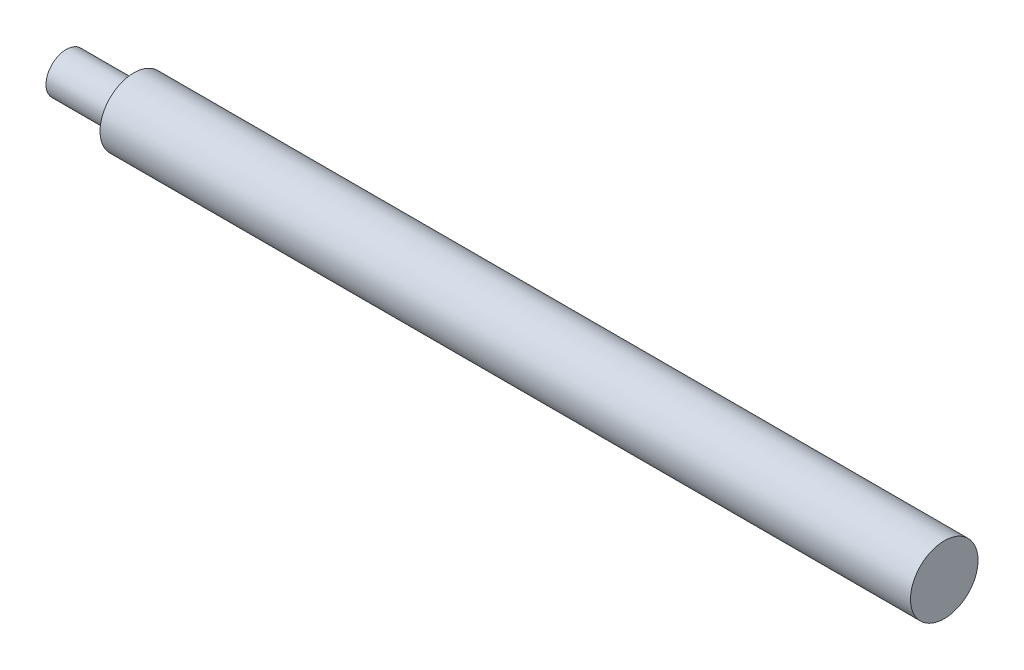
ISO-10303-21;
HEADER;
FILE_DESCRIPTION(('STEP AP214'),'2;1');
FILE_NAME('part.step','',(''),(''),'','','');
FILE_SCHEMA(('AUTOMOTIVE_DESIGN { 1 0 10303 214 1 1 1 1 }'));
ENDSEC;
DATA;
#1=APPLICATION_CONTEXT('core data for automotive mechanical design processes');
#2=APPLICATION_PROTOCOL_DEFINITION('international standard','automotive_design',2000,#1);
#3=PRODUCT_CONTEXT('',#1,'mechanical');
#4=PRODUCT('Part','Part','',(#3));
#5=PRODUCT_RELATED_PRODUCT_CATEGORY('part','',(#4));
#6=PRODUCT_DEFINITION_FORMATION('','',#4);
#7=PRODUCT_DEFINITION_CONTEXT('part definition',#1,'design');
#8=PRODUCT_DEFINITION('design','',#6,#7);
#9=PRODUCT_DEFINITION_SHAPE('','',#8);
#10=(LENGTH_UNIT() NAMED_UNIT(*) SI_UNIT(.MILLI.,.METRE.));
#11=(NAMED_UNIT(*) PLANE_ANGLE_UNIT() SI_UNIT($,.RADIAN.));
#12=(NAMED_UNIT(*) SI_UNIT($,.STERADIAN.) SOLID_ANGLE_UNIT());
#13=UNCERTAINTY_MEASURE_WITH_UNIT(LENGTH_MEASURE(1.E-05),#10,'distance_accuracy_value','');
#14=(GEOMETRIC_REPRESENTATION_CONTEXT(3) GLOBAL_UNCERTAINTY_ASSIGNED_CONTEXT((#13)) GLOBAL_UNIT_ASSIGNED_CONTEXT((#10,
#11,#12)) REPRESENTATION_CONTEXT('',''));
#15=CARTESIAN_POINT('',(0.,0.,0.));
#16=DIRECTION('',(0.,0.,1.));
#17=DIRECTION('',(1.,0.,0.));
#18=AXIS2_PLACEMENT_3D('',#15,#16,#17);
#19=CARTESIAN_POINT('',(-55.2920778714341,3.,0.));
#20=DIRECTION('',(1.,0.,0.));
#21=DIRECTION('',(0.,0.,-1.));
#22=AXIS2_PLACEMENT_3D('',#19,#20,#21);
#23=PLANE('',#22);
#24=CARTESIAN_POINT('',(-55.2920778714341,0.,0.));
#25=DIRECTION('',(-1.,0.,0.));
#26=DIRECTION('',(0.,0.,1.));
#27=AXIS2_PLACEMENT_3D('',#24,#25,#26);
#28=CIRCLE('',#27,3.);
#29=CARTESIAN_POINT('',(-55.2920778714341,0.,3.));
#30=VERTEX_POINT('',#29);
#31=EDGE_CURVE('E45',#30,#30,#28,.T.);
#32=ORIENTED_EDGE('',*,*,#31,.T.);
#33=EDGE_LOOP('',(#32));
#34=FACE_BOUND('',#33,.T.);
#35=ADVANCED_FACE('F31',(#34),#23,.F.);
#36=CARTESIAN_POINT('',(74.7079221285659,0.,0.));
#37=DIRECTION('',(-1.,0.,0.));
#38=DIRECTION('',(0.,0.,1.));
#39=AXIS2_PLACEMENT_3D('',#36,#37,#38);
#40=PLANE('',#39);
#41=CARTESIAN_POINT('',(74.7079221285659,0.,0.));
#42=DIRECTION('',(-1.,0.,0.));
#43=DIRECTION('',(0.,0.,1.));
#44=AXIS2_PLACEMENT_3D('',#41,#42,#43);
#45=CIRCLE('',#44,5.);
#46=CARTESIAN_POINT('',(74.7079221285659,0.,5.));
#47=VERTEX_POINT('',#46);
#48=EDGE_CURVE('E10',#47,#47,#45,.T.);
#49=ORIENTED_EDGE('',*,*,#48,.F.);
#50=EDGE_LOOP('',(#49));
#51=FACE_BOUND('',#50,.T.);
#52=ADVANCED_FACE('F65',(#51),#40,.F.);
#53=CARTESIAN_POINT('',(-55.2920778714341,0.,0.));
#54=DIRECTION('',(-1.,0.,0.));
#55=DIRECTION('',(0.,0.,1.));
#56=AXIS2_PLACEMENT_3D('',#53,#54,#55);
#57=CYLINDRICAL_SURFACE('',#56,4.99999999999999);
#58=CARTESIAN_POINT('',(-45.2920778714341,0.,0.));
#59=DIRECTION('',(-1.,0.,0.));
#60=DIRECTION('',(0.,0.,1.));
#61=AXIS2_PLACEMENT_3D('',#58,#59,#60);
#62=CIRCLE('',#61,4.99999999999999);
#63=CARTESIAN_POINT('',(-45.2920778714341,0.,4.99999999999999));
#64=VERTEX_POINT('',#63);
#65=EDGE_CURVE('E37',#64,#64,#62,.T.);
#66=ORIENTED_EDGE('',*,*,#65,.F.);
#67=EDGE_LOOP('',(#66));
#68=FACE_BOUND('',#67,.T.);
#69=ORIENTED_EDGE('',*,*,#48,.T.);
#70=EDGE_LOOP('',(#69));
#71=FACE_BOUND('',#70,.T.);
#72=ADVANCED_FACE('F60',(#68,#71),#57,.T.);
#73=CARTESIAN_POINT('',(-45.2920778714341,4.99999999999999,0.));
#74=DIRECTION('',(1.,0.,0.));
#75=DIRECTION('',(0.,0.,-1.));
#76=AXIS2_PLACEMENT_3D('',#73,#74,#75);
#77=PLANE('',#76);
#78=CARTESIAN_POINT('',(-45.2920778714341,0.,0.));
#79=DIRECTION('',(-1.,0.,0.));
#80=DIRECTION('',(0.,0.,1.));
#81=AXIS2_PLACEMENT_3D('',#78,#79,#80);
#82=CIRCLE('',#81,3.);
#83=CARTESIAN_POINT('',(-45.2920778714341,0.,3.));
#84=VERTEX_POINT('',#83);
#85=EDGE_CURVE('E41',#84,#84,#82,.T.);
#86=ORIENTED_EDGE('',*,*,#85,.F.);
#87=EDGE_LOOP('',(#86));
#88=FACE_BOUND('',#87,.T.);
#89=ORIENTED_EDGE('',*,*,#65,.T.);
#90=EDGE_LOOP('',(#89));
#91=FACE_BOUND('',#90,.T.);
#92=ADVANCED_FACE('F55',(#88,#91),#77,.F.);
#93=CARTESIAN_POINT('',(-55.2920778714341,0.,0.));
#94=DIRECTION('',(-1.,0.,0.));
#95=DIRECTION('',(0.,0.,1.));
#96=AXIS2_PLACEMENT_3D('',#93,#94,#95);
#97=CYLINDRICAL_SURFACE('',#96,3.);
#98=ORIENTED_EDGE('',*,*,#31,.F.);
#99=EDGE_LOOP('',(#98));
#100=FACE_BOUND('',#99,.T.);
#101=ORIENTED_EDGE('',*,*,#85,.T.);
#102=EDGE_LOOP('',(#101));
#103=FACE_BOUND('',#102,.T.);
#104=ADVANCED_FACE('F52',(#100,#103),#97,.T.);
#105=CLOSED_SHELL('',(#35,#52,#72,#92,#104));
#106=MANIFOLD_SOLID_BREP('B2',#105);
#107=ADVANCED_BREP_SHAPE_REPRESENTATION('',(#18,#106),#14);
#108=SHAPE_DEFINITION_REPRESENTATION(#9,#107);
ENDSEC;
END-ISO-10303-21;
